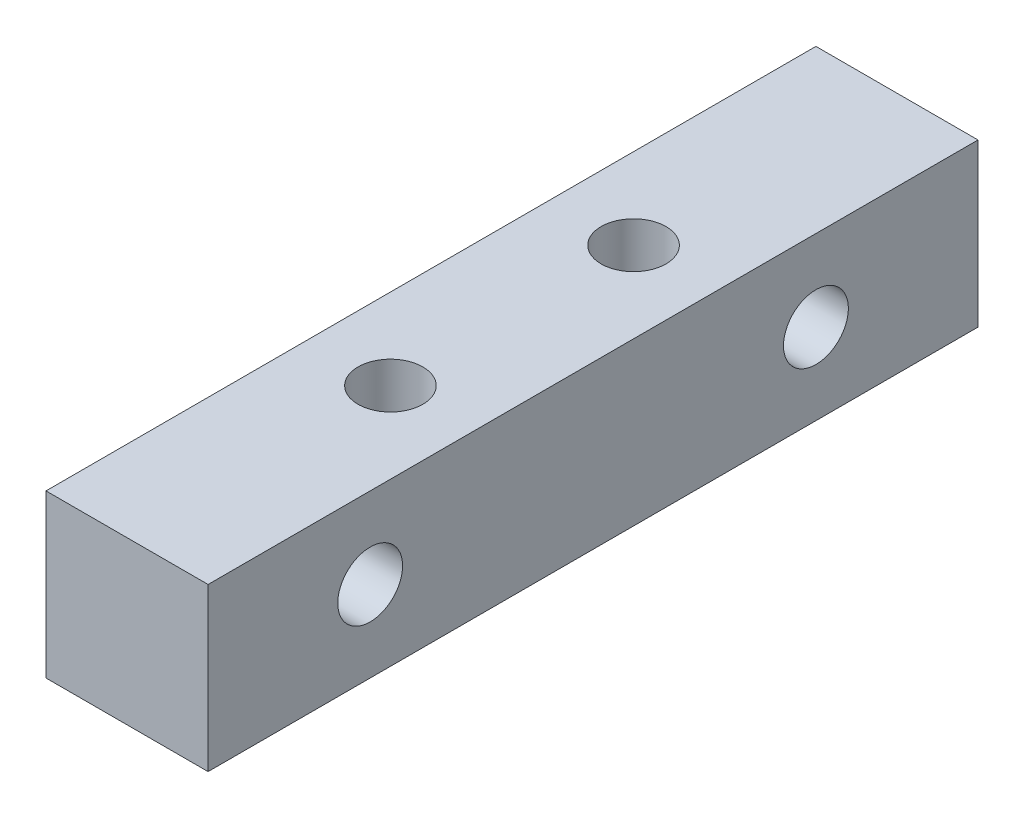
ISO-10303-21;
HEADER;
FILE_DESCRIPTION(('STEP AP214'),'2;1');
FILE_NAME('part.step','',(''),(''),'','','');
FILE_SCHEMA(('AUTOMOTIVE_DESIGN { 1 0 10303 214 1 1 1 1 }'));
ENDSEC;
DATA;
#1=APPLICATION_CONTEXT('core data for automotive mechanical design processes');
#2=APPLICATION_PROTOCOL_DEFINITION('international standard','automotive_design',2000,#1);
#3=PRODUCT_CONTEXT('',#1,'mechanical');
#4=PRODUCT('Part','Part','',(#3));
#5=PRODUCT_RELATED_PRODUCT_CATEGORY('part','',(#4));
#6=PRODUCT_DEFINITION_FORMATION('','',#4);
#7=PRODUCT_DEFINITION_CONTEXT('part definition',#1,'design');
#8=PRODUCT_DEFINITION('design','',#6,#7);
#9=PRODUCT_DEFINITION_SHAPE('','',#8);
#10=(LENGTH_UNIT() NAMED_UNIT(*) SI_UNIT(.MILLI.,.METRE.));
#11=(NAMED_UNIT(*) PLANE_ANGLE_UNIT() SI_UNIT($,.RADIAN.));
#12=(NAMED_UNIT(*) SI_UNIT($,.STERADIAN.) SOLID_ANGLE_UNIT());
#13=UNCERTAINTY_MEASURE_WITH_UNIT(LENGTH_MEASURE(1.E-05),#10,'distance_accuracy_value','');
#14=(GEOMETRIC_REPRESENTATION_CONTEXT(3) GLOBAL_UNCERTAINTY_ASSIGNED_CONTEXT((#13)) GLOBAL_UNIT_ASSIGNED_CONTEXT((#10,
#11,#12)) REPRESENTATION_CONTEXT('',''));
#15=CARTESIAN_POINT('',(0.,0.,0.));
#16=DIRECTION('',(0.,0.,1.));
#17=DIRECTION('',(1.,0.,0.));
#18=AXIS2_PLACEMENT_3D('',#15,#16,#17);
#19=CARTESIAN_POINT('',(4.,-4.,38.));
#20=DIRECTION('',(-1.,0.,0.));
#21=DIRECTION('',(0.,0.,1.));
#22=AXIS2_PLACEMENT_3D('',#19,#20,#21);
#23=PLANE('',#22);
#24=CARTESIAN_POINT('',(4.,0.,30.));
#25=DIRECTION('',(1.,0.,0.));
#26=DIRECTION('',(0.,0.,-1.));
#27=AXIS2_PLACEMENT_3D('',#24,#25,#26);
#28=CIRCLE('',#27,1.6);
#29=CARTESIAN_POINT('',(4.,0.,28.4));
#30=VERTEX_POINT('',#29);
#31=EDGE_CURVE('E131',#30,#30,#28,.T.);
#32=ORIENTED_EDGE('',*,*,#31,.F.);
#33=EDGE_LOOP('',(#32));
#34=FACE_BOUND('',#33,.T.);
#35=CARTESIAN_POINT('',(4.,0.,8.));
#36=DIRECTION('',(1.,0.,0.));
#37=DIRECTION('',(0.,0.,1.));
#38=AXIS2_PLACEMENT_3D('',#35,#36,#37);
#39=CIRCLE('',#38,1.6);
#40=CARTESIAN_POINT('',(4.,0.,9.6));
#41=VERTEX_POINT('',#40);
#42=EDGE_CURVE('E125',#41,#41,#39,.T.);
#43=ORIENTED_EDGE('',*,*,#42,.F.);
#44=EDGE_LOOP('',(#43));
#45=FACE_BOUND('',#44,.T.);
#46=DIRECTION('',(0.,1.,0.));
#47=VECTOR('',#46,1.);
#48=CARTESIAN_POINT('',(4.,-4.,0.));
#49=LINE('',#48,#47);
#50=CARTESIAN_POINT('',(4.,-4.,0.));
#51=VERTEX_POINT('',#50);
#52=CARTESIAN_POINT('',(4.,4.,0.));
#53=VERTEX_POINT('',#52);
#54=EDGE_CURVE('E99',#51,#53,#49,.T.);
#55=ORIENTED_EDGE('',*,*,#54,.T.);
#56=DIRECTION('',(0.,0.,-1.));
#57=VECTOR('',#56,1.);
#58=CARTESIAN_POINT('',(4.,4.,38.));
#59=LINE('',#58,#57);
#60=CARTESIAN_POINT('',(4.,4.,38.));
#61=VERTEX_POINT('',#60);
#62=EDGE_CURVE('E11',#61,#53,#59,.T.);
#63=ORIENTED_EDGE('',*,*,#62,.F.);
#64=DIRECTION('',(0.,1.,0.));
#65=VECTOR('',#64,1.);
#66=CARTESIAN_POINT('',(4.,-4.,38.));
#67=LINE('',#66,#65);
#68=CARTESIAN_POINT('',(4.,-4.,38.));
#69=VERTEX_POINT('',#68);
#70=EDGE_CURVE('E87',#69,#61,#67,.T.);
#71=ORIENTED_EDGE('',*,*,#70,.F.);
#72=DIRECTION('',(0.,0.,-1.));
#73=VECTOR('',#72,1.);
#74=CARTESIAN_POINT('',(4.,-4.,38.));
#75=LINE('',#74,#73);
#76=EDGE_CURVE('E95',#69,#51,#75,.T.);
#77=ORIENTED_EDGE('',*,*,#76,.T.);
#78=EDGE_LOOP('',(#55,#63,#71,#77));
#79=FACE_BOUND('',#78,.T.);
#80=ADVANCED_FACE('F36',(#34,#45,#79),#23,.F.);
#81=CARTESIAN_POINT('',(-4.,4.,38.));
#82=DIRECTION('',(0.,-1.,0.));
#83=DIRECTION('',(0.,0.,-1.));
#84=AXIS2_PLACEMENT_3D('',#81,#82,#83);
#85=PLANE('',#84);
#86=CARTESIAN_POINT('',(0.,4.,13.));
#87=DIRECTION('',(0.,1.,0.));
#88=DIRECTION('',(0.,0.,1.));
#89=AXIS2_PLACEMENT_3D('',#86,#87,#88);
#90=CIRCLE('',#89,1.6);
#91=CARTESIAN_POINT('',(0.,4.,14.6));
#92=VERTEX_POINT('',#91);
#93=EDGE_CURVE('E120',#92,#92,#90,.T.);
#94=ORIENTED_EDGE('',*,*,#93,.F.);
#95=EDGE_LOOP('',(#94));
#96=FACE_BOUND('',#95,.T.);
#97=CARTESIAN_POINT('',(0.,4.,25.));
#98=DIRECTION('',(0.,1.,0.));
#99=DIRECTION('',(0.,0.,-1.));
#100=AXIS2_PLACEMENT_3D('',#97,#98,#99);
#101=CIRCLE('',#100,1.6);
#102=CARTESIAN_POINT('',(0.,4.,23.4));
#103=VERTEX_POINT('',#102);
#104=EDGE_CURVE('E113',#103,#103,#101,.T.);
#105=ORIENTED_EDGE('',*,*,#104,.F.);
#106=EDGE_LOOP('',(#105));
#107=FACE_BOUND('',#106,.T.);
#108=DIRECTION('',(-1.,0.,0.));
#109=VECTOR('',#108,1.);
#110=CARTESIAN_POINT('',(-4.,4.,0.));
#111=LINE('',#110,#109);
#112=CARTESIAN_POINT('',(-4.,4.,0.));
#113=VERTEX_POINT('',#112);
#114=EDGE_CURVE('E91',#53,#113,#111,.T.);
#115=ORIENTED_EDGE('',*,*,#114,.T.);
#116=DIRECTION('',(0.,0.,-1.));
#117=VECTOR('',#116,1.);
#118=CARTESIAN_POINT('',(-4.,4.,38.));
#119=LINE('',#118,#117);
#120=CARTESIAN_POINT('',(-4.,4.,38.));
#121=VERTEX_POINT('',#120);
#122=EDGE_CURVE('E44',#121,#113,#119,.T.);
#123=ORIENTED_EDGE('',*,*,#122,.F.);
#124=DIRECTION('',(-1.,0.,0.));
#125=VECTOR('',#124,1.);
#126=CARTESIAN_POINT('',(-4.,4.,38.));
#127=LINE('',#126,#125);
#128=EDGE_CURVE('E82',#61,#121,#127,.T.);
#129=ORIENTED_EDGE('',*,*,#128,.F.);
#130=ORIENTED_EDGE('',*,*,#62,.T.);
#131=EDGE_LOOP('',(#115,#123,#129,#130));
#132=FACE_BOUND('',#131,.T.);
#133=ADVANCED_FACE('F90',(#96,#107,#132),#85,.F.);
#134=CARTESIAN_POINT('',(-4.,-4.,38.));
#135=DIRECTION('',(1.,0.,0.));
#136=DIRECTION('',(0.,0.,-1.));
#137=AXIS2_PLACEMENT_3D('',#134,#135,#136);
#138=PLANE('',#137);
#139=CARTESIAN_POINT('',(-4.,0.,30.));
#140=DIRECTION('',(1.,0.,0.));
#141=DIRECTION('',(0.,0.,-1.));
#142=AXIS2_PLACEMENT_3D('',#139,#140,#141);
#143=CIRCLE('',#142,1.6);
#144=CARTESIAN_POINT('',(-4.,0.,28.4));
#145=VERTEX_POINT('',#144);
#146=EDGE_CURVE('E117',#145,#145,#143,.T.);
#147=ORIENTED_EDGE('',*,*,#146,.T.);
#148=EDGE_LOOP('',(#147));
#149=FACE_BOUND('',#148,.T.);
#150=CARTESIAN_POINT('',(-4.,0.,8.));
#151=DIRECTION('',(1.,0.,0.));
#152=DIRECTION('',(0.,0.,1.));
#153=AXIS2_PLACEMENT_3D('',#150,#151,#152);
#154=CIRCLE('',#153,1.6);
#155=CARTESIAN_POINT('',(-4.,0.,9.6));
#156=VERTEX_POINT('',#155);
#157=EDGE_CURVE('E128',#156,#156,#154,.T.);
#158=ORIENTED_EDGE('',*,*,#157,.T.);
#159=EDGE_LOOP('',(#158));
#160=FACE_BOUND('',#159,.T.);
#161=DIRECTION('',(0.,-1.,0.));
#162=VECTOR('',#161,1.);
#163=CARTESIAN_POINT('',(-4.,-4.,0.));
#164=LINE('',#163,#162);
#165=CARTESIAN_POINT('',(-4.,-4.,0.));
#166=VERTEX_POINT('',#165);
#167=EDGE_CURVE('E69',#113,#166,#164,.T.);
#168=ORIENTED_EDGE('',*,*,#167,.T.);
#169=DIRECTION('',(0.,0.,-1.));
#170=VECTOR('',#169,1.);
#171=CARTESIAN_POINT('',(-4.,-4.,38.));
#172=LINE('',#171,#170);
#173=CARTESIAN_POINT('',(-4.,-4.,38.));
#174=VERTEX_POINT('',#173);
#175=EDGE_CURVE('E92',#174,#166,#172,.T.);
#176=ORIENTED_EDGE('',*,*,#175,.F.);
#177=DIRECTION('',(0.,-1.,0.));
#178=VECTOR('',#177,1.);
#179=CARTESIAN_POINT('',(-4.,-4.,38.));
#180=LINE('',#179,#178);
#181=EDGE_CURVE('E85',#121,#174,#180,.T.);
#182=ORIENTED_EDGE('',*,*,#181,.F.);
#183=ORIENTED_EDGE('',*,*,#122,.T.);
#184=EDGE_LOOP('',(#168,#176,#182,#183));
#185=FACE_BOUND('',#184,.T.);
#186=ADVANCED_FACE('F93',(#149,#160,#185),#138,.F.);
#187=CARTESIAN_POINT('',(-4.,-4.,38.));
#188=DIRECTION('',(0.,1.,0.));
#189=DIRECTION('',(0.,0.,1.));
#190=AXIS2_PLACEMENT_3D('',#187,#188,#189);
#191=PLANE('',#190);
#192=CARTESIAN_POINT('',(0.,-4.,13.));
#193=DIRECTION('',(0.,1.,0.));
#194=DIRECTION('',(0.,0.,1.));
#195=AXIS2_PLACEMENT_3D('',#192,#193,#194);
#196=CIRCLE('',#195,1.6);
#197=CARTESIAN_POINT('',(0.,-4.,14.6));
#198=VERTEX_POINT('',#197);
#199=EDGE_CURVE('E102',#198,#198,#196,.T.);
#200=ORIENTED_EDGE('',*,*,#199,.T.);
#201=EDGE_LOOP('',(#200));
#202=FACE_BOUND('',#201,.T.);
#203=CARTESIAN_POINT('',(0.,-4.,25.));
#204=DIRECTION('',(0.,1.,0.));
#205=DIRECTION('',(0.,0.,-1.));
#206=AXIS2_PLACEMENT_3D('',#203,#204,#205);
#207=CIRCLE('',#206,1.6);
#208=CARTESIAN_POINT('',(0.,-4.,23.4));
#209=VERTEX_POINT('',#208);
#210=EDGE_CURVE('E116',#209,#209,#207,.T.);
#211=ORIENTED_EDGE('',*,*,#210,.T.);
#212=EDGE_LOOP('',(#211));
#213=FACE_BOUND('',#212,.T.);
#214=DIRECTION('',(1.,0.,0.));
#215=VECTOR('',#214,1.);
#216=CARTESIAN_POINT('',(-4.,-4.,0.));
#217=LINE('',#216,#215);
#218=EDGE_CURVE('E75',#166,#51,#217,.T.);
#219=ORIENTED_EDGE('',*,*,#218,.T.);
#220=ORIENTED_EDGE('',*,*,#76,.F.);
#221=DIRECTION('',(1.,0.,0.));
#222=VECTOR('',#221,1.);
#223=CARTESIAN_POINT('',(-4.,-4.,38.));
#224=LINE('',#223,#222);
#225=EDGE_CURVE('E52',#174,#69,#224,.T.);
#226=ORIENTED_EDGE('',*,*,#225,.F.);
#227=ORIENTED_EDGE('',*,*,#175,.T.);
#228=EDGE_LOOP('',(#219,#220,#226,#227));
#229=FACE_BOUND('',#228,.T.);
#230=ADVANCED_FACE('F107',(#202,#213,#229),#191,.F.);
#231=CARTESIAN_POINT('',(0.,0.,38.));
#232=DIRECTION('',(0.,0.,-1.));
#233=DIRECTION('',(-1.,0.,0.));
#234=AXIS2_PLACEMENT_3D('',#231,#232,#233);
#235=PLANE('',#234);
#236=ORIENTED_EDGE('',*,*,#70,.T.);
#237=ORIENTED_EDGE('',*,*,#128,.T.);
#238=ORIENTED_EDGE('',*,*,#181,.T.);
#239=ORIENTED_EDGE('',*,*,#225,.T.);
#240=EDGE_LOOP('',(#236,#237,#238,#239));
#241=FACE_BOUND('',#240,.T.);
#242=ADVANCED_FACE('F83',(#241),#235,.F.);
#243=CARTESIAN_POINT('',(0.,0.,0.));
#244=DIRECTION('',(0.,0.,-1.));
#245=DIRECTION('',(-1.,0.,0.));
#246=AXIS2_PLACEMENT_3D('',#243,#244,#245);
#247=PLANE('',#246);
#248=ORIENTED_EDGE('',*,*,#54,.F.);
#249=ORIENTED_EDGE('',*,*,#218,.F.);
#250=ORIENTED_EDGE('',*,*,#167,.F.);
#251=ORIENTED_EDGE('',*,*,#114,.F.);
#252=EDGE_LOOP('',(#248,#249,#250,#251));
#253=FACE_BOUND('',#252,.T.);
#254=ADVANCED_FACE('F110',(#253),#247,.T.);
#255=CARTESIAN_POINT('',(0.,-4.,25.));
#256=DIRECTION('',(0.,1.,0.));
#257=DIRECTION('',(0.,0.,1.));
#258=AXIS2_PLACEMENT_3D('',#255,#256,#257);
#259=CYLINDRICAL_SURFACE('',#258,1.6);
#260=ORIENTED_EDGE('',*,*,#210,.F.);
#261=EDGE_LOOP('',(#260));
#262=FACE_BOUND('',#261,.T.);
#263=ORIENTED_EDGE('',*,*,#104,.T.);
#264=EDGE_LOOP('',(#263));
#265=FACE_BOUND('',#264,.T.);
#266=ADVANCED_FACE('F157',(#262,#265),#259,.F.);
#267=CARTESIAN_POINT('',(0.,-4.,13.));
#268=DIRECTION('',(0.,1.,0.));
#269=DIRECTION('',(0.,0.,1.));
#270=AXIS2_PLACEMENT_3D('',#267,#268,#269);
#271=CYLINDRICAL_SURFACE('',#270,1.6);
#272=ORIENTED_EDGE('',*,*,#199,.F.);
#273=EDGE_LOOP('',(#272));
#274=FACE_BOUND('',#273,.T.);
#275=ORIENTED_EDGE('',*,*,#93,.T.);
#276=EDGE_LOOP('',(#275));
#277=FACE_BOUND('',#276,.T.);
#278=ADVANCED_FACE('F151',(#274,#277),#271,.F.);
#279=CARTESIAN_POINT('',(-4.,0.,8.));
#280=DIRECTION('',(1.,0.,0.));
#281=DIRECTION('',(0.,0.,-1.));
#282=AXIS2_PLACEMENT_3D('',#279,#280,#281);
#283=CYLINDRICAL_SURFACE('',#282,1.6);
#284=ORIENTED_EDGE('',*,*,#157,.F.);
#285=EDGE_LOOP('',(#284));
#286=FACE_BOUND('',#285,.T.);
#287=ORIENTED_EDGE('',*,*,#42,.T.);
#288=EDGE_LOOP('',(#287));
#289=FACE_BOUND('',#288,.T.);
#290=ADVANCED_FACE('F142',(#286,#289),#283,.F.);
#291=CARTESIAN_POINT('',(-4.,0.,30.));
#292=DIRECTION('',(1.,0.,0.));
#293=DIRECTION('',(0.,0.,-1.));
#294=AXIS2_PLACEMENT_3D('',#291,#292,#293);
#295=CYLINDRICAL_SURFACE('',#294,1.6);
#296=ORIENTED_EDGE('',*,*,#146,.F.);
#297=EDGE_LOOP('',(#296));
#298=FACE_BOUND('',#297,.T.);
#299=ORIENTED_EDGE('',*,*,#31,.T.);
#300=EDGE_LOOP('',(#299));
#301=FACE_BOUND('',#300,.T.);
#302=ADVANCED_FACE('F139',(#298,#301),#295,.F.);
#303=CLOSED_SHELL('',(#80,#133,#186,#230,#242,#254,#266,#278,#290,#302));
#304=MANIFOLD_SOLID_BREP('B2',#303);
#305=ADVANCED_BREP_SHAPE_REPRESENTATION('',(#18,#304),#14);
#306=SHAPE_DEFINITION_REPRESENTATION(#9,#305);
ENDSEC;
END-ISO-10303-21;
